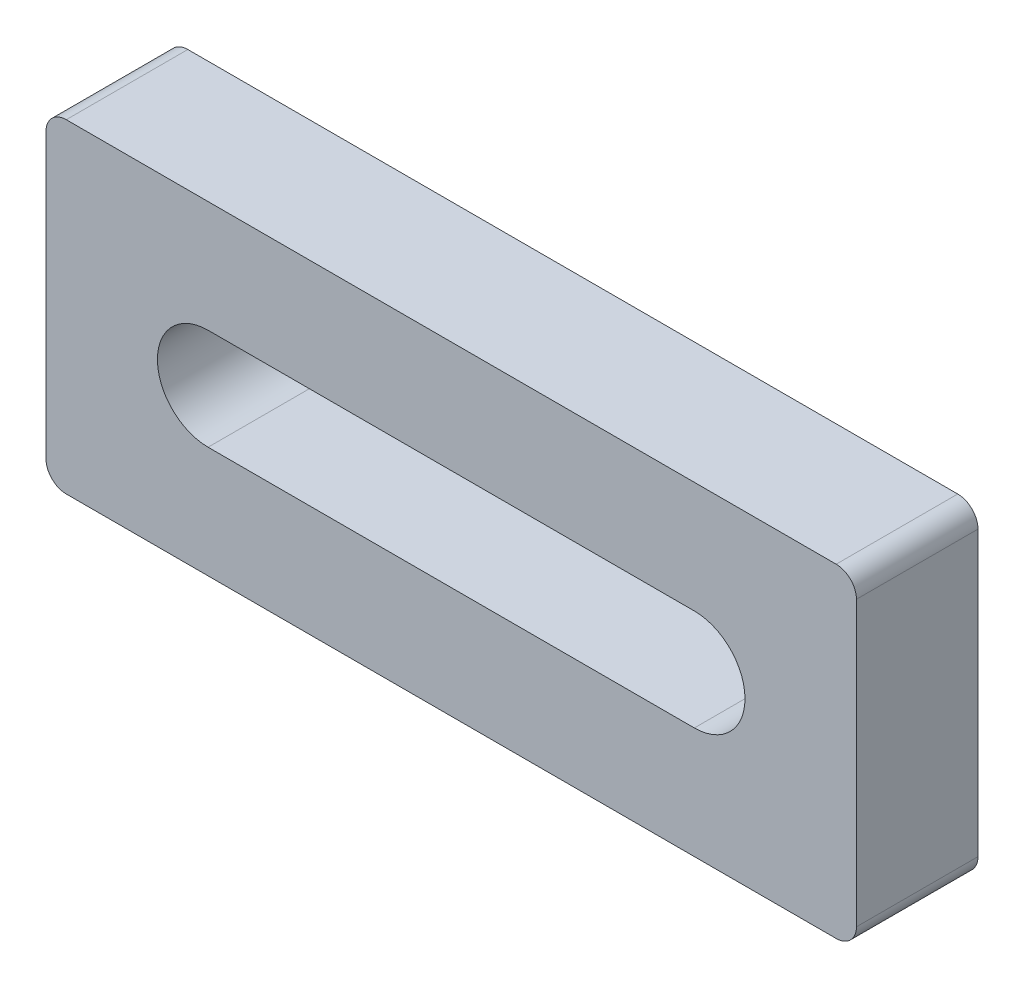
ISO-10303-21;
HEADER;
FILE_DESCRIPTION(('STEP AP214'),'2;1');
FILE_NAME('part.step','',(''),(''),'','','');
FILE_SCHEMA(('AUTOMOTIVE_DESIGN { 1 0 10303 214 1 1 1 1 }'));
ENDSEC;
DATA;
#1=APPLICATION_CONTEXT('core data for automotive mechanical design processes');
#2=APPLICATION_PROTOCOL_DEFINITION('international standard','automotive_design',2000,#1);
#3=PRODUCT_CONTEXT('',#1,'mechanical');
#4=PRODUCT('Part','Part','',(#3));
#5=PRODUCT_RELATED_PRODUCT_CATEGORY('part','',(#4));
#6=PRODUCT_DEFINITION_FORMATION('','',#4);
#7=PRODUCT_DEFINITION_CONTEXT('part definition',#1,'design');
#8=PRODUCT_DEFINITION('design','',#6,#7);
#9=PRODUCT_DEFINITION_SHAPE('','',#8);
#10=(LENGTH_UNIT() NAMED_UNIT(*) SI_UNIT(.MILLI.,.METRE.));
#11=(NAMED_UNIT(*) PLANE_ANGLE_UNIT() SI_UNIT($,.RADIAN.));
#12=(NAMED_UNIT(*) SI_UNIT($,.STERADIAN.) SOLID_ANGLE_UNIT());
#13=UNCERTAINTY_MEASURE_WITH_UNIT(LENGTH_MEASURE(1.E-05),#10,'distance_accuracy_value','');
#14=(GEOMETRIC_REPRESENTATION_CONTEXT(3) GLOBAL_UNCERTAINTY_ASSIGNED_CONTEXT((#13)) GLOBAL_UNIT_ASSIGNED_CONTEXT((#10,
#11,#12)) REPRESENTATION_CONTEXT('',''));
#15=CARTESIAN_POINT('',(0.,0.,0.));
#16=DIRECTION('',(0.,0.,1.));
#17=DIRECTION('',(1.,0.,0.));
#18=AXIS2_PLACEMENT_3D('',#15,#16,#17);
#19=CARTESIAN_POINT('',(-196.85,-3.1749999999999,19.05));
#20=DIRECTION('',(0.,0.,1.));
#21=DIRECTION('',(1.,0.,0.));
#22=AXIS2_PLACEMENT_3D('',#19,#20,#21);
#23=PLANE('',#22);
#24=CARTESIAN_POINT('',(-196.85,-3.1749999999999,19.05));
#25=DIRECTION('',(0.,0.,1.));
#26=DIRECTION('',(1.,0.,0.));
#27=AXIS2_PLACEMENT_3D('',#24,#25,#26);
#28=CIRCLE('',#27,3.17500000000001);
#29=CARTESIAN_POINT('',(-200.025,-3.1749999999999,19.05));
#30=VERTEX_POINT('',#29);
#31=CARTESIAN_POINT('',(-196.85,-6.3499999999999,19.05));
#32=VERTEX_POINT('',#31);
#33=EDGE_CURVE('E175',#30,#32,#28,.T.);
#34=ORIENTED_EDGE('',*,*,#33,.T.);
#35=DIRECTION('',(1.,0.,0.));
#36=VECTOR('',#35,1.);
#37=CARTESIAN_POINT('',(-76.2,-6.34999999999988,19.05));
#38=LINE('',#37,#36);
#39=CARTESIAN_POINT('',(-76.2,-6.34999999999988,19.05));
#40=VERTEX_POINT('',#39);
#41=EDGE_CURVE('E178',#32,#40,#38,.T.);
#42=ORIENTED_EDGE('',*,*,#41,.T.);
#43=CARTESIAN_POINT('',(-76.2,-3.17499999999988,19.05));
#44=DIRECTION('',(0.,0.,1.));
#45=DIRECTION('',(1.,0.,0.));
#46=AXIS2_PLACEMENT_3D('',#43,#44,#45);
#47=CIRCLE('',#46,3.175);
#48=CARTESIAN_POINT('',(-73.025,-3.17499999999988,19.05));
#49=VERTEX_POINT('',#48);
#50=EDGE_CURVE('E180',#40,#49,#47,.T.);
#51=ORIENTED_EDGE('',*,*,#50,.T.);
#52=DIRECTION('',(0.,1.,0.));
#53=VECTOR('',#52,1.);
#54=CARTESIAN_POINT('',(-73.025,-3.17499999999988,19.05));
#55=LINE('',#54,#53);
#56=CARTESIAN_POINT('',(-73.025,41.2750000000001,19.05));
#57=VERTEX_POINT('',#56);
#58=EDGE_CURVE('E182',#49,#57,#55,.T.);
#59=ORIENTED_EDGE('',*,*,#58,.T.);
#60=CARTESIAN_POINT('',(-76.2,41.2750000000001,19.05));
#61=DIRECTION('',(0.,0.,1.));
#62=DIRECTION('',(-1.,0.,0.));
#63=AXIS2_PLACEMENT_3D('',#60,#61,#62);
#64=CIRCLE('',#63,3.17499999999999);
#65=CARTESIAN_POINT('',(-76.2,44.4500000000001,19.05));
#66=VERTEX_POINT('',#65);
#67=EDGE_CURVE('E184',#57,#66,#64,.T.);
#68=ORIENTED_EDGE('',*,*,#67,.T.);
#69=DIRECTION('',(-1.,0.,0.));
#70=VECTOR('',#69,1.);
#71=CARTESIAN_POINT('',(-76.2,44.4500000000001,19.05));
#72=LINE('',#71,#70);
#73=CARTESIAN_POINT('',(-196.85,44.4500000000001,19.05));
#74=VERTEX_POINT('',#73);
#75=EDGE_CURVE('E186',#66,#74,#72,.T.);
#76=ORIENTED_EDGE('',*,*,#75,.T.);
#77=CARTESIAN_POINT('',(-196.85,41.2750000000001,19.05));
#78=DIRECTION('',(0.,0.,1.));
#79=DIRECTION('',(-1.,0.,0.));
#80=AXIS2_PLACEMENT_3D('',#77,#78,#79);
#81=CIRCLE('',#80,3.175);
#82=CARTESIAN_POINT('',(-200.025,41.2750000000001,19.05));
#83=VERTEX_POINT('',#82);
#84=EDGE_CURVE('E188',#74,#83,#81,.T.);
#85=ORIENTED_EDGE('',*,*,#84,.T.);
#86=DIRECTION('',(0.,-1.,0.));
#87=VECTOR('',#86,1.);
#88=CARTESIAN_POINT('',(-200.025,-3.1749999999999,19.05));
#89=LINE('',#88,#87);
#90=EDGE_CURVE('E190',#83,#30,#89,.T.);
#91=ORIENTED_EDGE('',*,*,#90,.T.);
#92=EDGE_LOOP('',(#34,#42,#51,#59,#68,#76,#85,#91));
#93=FACE_BOUND('',#92,.T.);
#94=DIRECTION('',(-1.,0.,0.));
#95=VECTOR('',#94,1.);
#96=CARTESIAN_POINT('',(-174.625,26.9875,19.05));
#97=LINE('',#96,#95);
#98=CARTESIAN_POINT('',(-98.425,26.9875,19.05));
#99=VERTEX_POINT('',#98);
#100=CARTESIAN_POINT('',(-174.625,26.9875,19.05));
#101=VERTEX_POINT('',#100);
#102=EDGE_CURVE('E149',#99,#101,#97,.T.);
#103=ORIENTED_EDGE('',*,*,#102,.F.);
#104=CARTESIAN_POINT('',(-98.425,19.05,19.05));
#105=DIRECTION('',(0.,0.,1.));
#106=DIRECTION('',(1.,0.,0.));
#107=AXIS2_PLACEMENT_3D('',#104,#105,#106);
#108=CIRCLE('',#107,7.93749999999999);
#109=CARTESIAN_POINT('',(-98.425,11.1125,19.05));
#110=VERTEX_POINT('',#109);
#111=EDGE_CURVE('E138',#110,#99,#108,.T.);
#112=ORIENTED_EDGE('',*,*,#111,.F.);
#113=DIRECTION('',(1.,0.,0.));
#114=VECTOR('',#113,1.);
#115=CARTESIAN_POINT('',(-174.625,11.1125,19.05));
#116=LINE('',#115,#114);
#117=CARTESIAN_POINT('',(-174.625,11.1125,19.05));
#118=VERTEX_POINT('',#117);
#119=EDGE_CURVE('E153',#118,#110,#116,.T.);
#120=ORIENTED_EDGE('',*,*,#119,.F.);
#121=CARTESIAN_POINT('',(-174.625,19.05,19.05));
#122=DIRECTION('',(0.,0.,1.));
#123=DIRECTION('',(1.,0.,0.));
#124=AXIS2_PLACEMENT_3D('',#121,#122,#123);
#125=CIRCLE('',#124,7.93749999999999);
#126=EDGE_CURVE('E151',#101,#118,#125,.T.);
#127=ORIENTED_EDGE('',*,*,#126,.F.);
#128=EDGE_LOOP('',(#103,#112,#120,#127));
#129=FACE_BOUND('',#128,.T.);
#130=ADVANCED_FACE('F34',(#93,#129),#23,.T.);
#131=CARTESIAN_POINT('',(-196.85,-3.1749999999999,0.));
#132=DIRECTION('',(0.,0.,1.));
#133=DIRECTION('',(1.,0.,0.));
#134=AXIS2_PLACEMENT_3D('',#131,#132,#133);
#135=PLANE('',#134);
#136=CARTESIAN_POINT('',(-196.85,-3.1749999999999,0.));
#137=DIRECTION('',(0.,0.,1.));
#138=DIRECTION('',(1.,0.,0.));
#139=AXIS2_PLACEMENT_3D('',#136,#137,#138);
#140=CIRCLE('',#139,3.17500000000001);
#141=CARTESIAN_POINT('',(-200.025,-3.1749999999999,0.));
#142=VERTEX_POINT('',#141);
#143=CARTESIAN_POINT('',(-196.85,-6.3499999999999,0.));
#144=VERTEX_POINT('',#143);
#145=EDGE_CURVE('E139',#142,#144,#140,.T.);
#146=ORIENTED_EDGE('',*,*,#145,.F.);
#147=DIRECTION('',(0.,-1.,0.));
#148=VECTOR('',#147,1.);
#149=CARTESIAN_POINT('',(-200.025,-3.1749999999999,0.));
#150=LINE('',#149,#148);
#151=CARTESIAN_POINT('',(-200.025,41.2750000000001,0.));
#152=VERTEX_POINT('',#151);
#153=EDGE_CURVE('E173',#152,#142,#150,.T.);
#154=ORIENTED_EDGE('',*,*,#153,.F.);
#155=CARTESIAN_POINT('',(-196.85,41.2750000000001,0.));
#156=DIRECTION('',(0.,0.,1.));
#157=DIRECTION('',(-1.,0.,0.));
#158=AXIS2_PLACEMENT_3D('',#155,#156,#157);
#159=CIRCLE('',#158,3.175);
#160=CARTESIAN_POINT('',(-196.85,44.4500000000001,0.));
#161=VERTEX_POINT('',#160);
#162=EDGE_CURVE('E171',#161,#152,#159,.T.);
#163=ORIENTED_EDGE('',*,*,#162,.F.);
#164=DIRECTION('',(-1.,0.,0.));
#165=VECTOR('',#164,1.);
#166=CARTESIAN_POINT('',(-76.2,44.4500000000001,0.));
#167=LINE('',#166,#165);
#168=CARTESIAN_POINT('',(-76.2,44.4500000000001,0.));
#169=VERTEX_POINT('',#168);
#170=EDGE_CURVE('E169',#169,#161,#167,.T.);
#171=ORIENTED_EDGE('',*,*,#170,.F.);
#172=CARTESIAN_POINT('',(-76.2,41.2750000000001,0.));
#173=DIRECTION('',(0.,0.,1.));
#174=DIRECTION('',(-1.,0.,0.));
#175=AXIS2_PLACEMENT_3D('',#172,#173,#174);
#176=CIRCLE('',#175,3.17499999999999);
#177=CARTESIAN_POINT('',(-73.025,41.2750000000001,0.));
#178=VERTEX_POINT('',#177);
#179=EDGE_CURVE('E167',#178,#169,#176,.T.);
#180=ORIENTED_EDGE('',*,*,#179,.F.);
#181=DIRECTION('',(0.,1.,0.));
#182=VECTOR('',#181,1.);
#183=CARTESIAN_POINT('',(-73.025,-3.17499999999988,0.));
#184=LINE('',#183,#182);
#185=CARTESIAN_POINT('',(-73.025,-3.17499999999988,0.));
#186=VERTEX_POINT('',#185);
#187=EDGE_CURVE('E165',#186,#178,#184,.T.);
#188=ORIENTED_EDGE('',*,*,#187,.F.);
#189=CARTESIAN_POINT('',(-76.2,-3.17499999999988,0.));
#190=DIRECTION('',(0.,0.,1.));
#191=DIRECTION('',(1.,0.,0.));
#192=AXIS2_PLACEMENT_3D('',#189,#190,#191);
#193=CIRCLE('',#192,3.175);
#194=CARTESIAN_POINT('',(-76.2,-6.34999999999988,0.));
#195=VERTEX_POINT('',#194);
#196=EDGE_CURVE('E163',#195,#186,#193,.T.);
#197=ORIENTED_EDGE('',*,*,#196,.F.);
#198=DIRECTION('',(1.,0.,0.));
#199=VECTOR('',#198,1.);
#200=CARTESIAN_POINT('',(-76.2,-6.34999999999988,0.));
#201=LINE('',#200,#199);
#202=EDGE_CURVE('E161',#144,#195,#201,.T.);
#203=ORIENTED_EDGE('',*,*,#202,.F.);
#204=EDGE_LOOP('',(#146,#154,#163,#171,#180,#188,#197,#203));
#205=FACE_BOUND('',#204,.T.);
#206=CARTESIAN_POINT('',(-98.425,19.05,0.));
#207=DIRECTION('',(0.,0.,1.));
#208=DIRECTION('',(1.,0.,0.));
#209=AXIS2_PLACEMENT_3D('',#206,#207,#208);
#210=CIRCLE('',#209,7.93749999999999);
#211=CARTESIAN_POINT('',(-98.425,11.1125,0.));
#212=VERTEX_POINT('',#211);
#213=CARTESIAN_POINT('',(-98.425,26.9875,0.));
#214=VERTEX_POINT('',#213);
#215=EDGE_CURVE('E57',#212,#214,#210,.T.);
#216=ORIENTED_EDGE('',*,*,#215,.T.);
#217=DIRECTION('',(-1.,0.,0.));
#218=VECTOR('',#217,1.);
#219=CARTESIAN_POINT('',(-174.625,26.9875,0.));
#220=LINE('',#219,#218);
#221=CARTESIAN_POINT('',(-174.625,26.9875,0.));
#222=VERTEX_POINT('',#221);
#223=EDGE_CURVE('E125',#214,#222,#220,.T.);
#224=ORIENTED_EDGE('',*,*,#223,.T.);
#225=CARTESIAN_POINT('',(-174.625,19.05,0.));
#226=DIRECTION('',(0.,0.,1.));
#227=DIRECTION('',(1.,0.,0.));
#228=AXIS2_PLACEMENT_3D('',#225,#226,#227);
#229=CIRCLE('',#228,7.93749999999999);
#230=CARTESIAN_POINT('',(-174.625,11.1125,0.));
#231=VERTEX_POINT('',#230);
#232=EDGE_CURVE('E134',#222,#231,#229,.T.);
#233=ORIENTED_EDGE('',*,*,#232,.T.);
#234=DIRECTION('',(1.,0.,0.));
#235=VECTOR('',#234,1.);
#236=CARTESIAN_POINT('',(-174.625,11.1125,0.));
#237=LINE('',#236,#235);
#238=EDGE_CURVE('E143',#231,#212,#237,.T.);
#239=ORIENTED_EDGE('',*,*,#238,.T.);
#240=EDGE_LOOP('',(#216,#224,#233,#239));
#241=FACE_BOUND('',#240,.T.);
#242=ADVANCED_FACE('F142',(#205,#241),#135,.F.);
#243=CARTESIAN_POINT('',(-196.85,-3.1749999999999,19.05));
#244=DIRECTION('',(0.,0.,-1.));
#245=DIRECTION('',(-1.,0.,0.));
#246=AXIS2_PLACEMENT_3D('',#243,#244,#245);
#247=CYLINDRICAL_SURFACE('',#246,3.17500000000001);
#248=ORIENTED_EDGE('',*,*,#145,.T.);
#249=DIRECTION('',(0.,0.,-1.));
#250=VECTOR('',#249,1.);
#251=CARTESIAN_POINT('',(-196.85,-6.3499999999999,19.05));
#252=LINE('',#251,#250);
#253=EDGE_CURVE('E12',#32,#144,#252,.T.);
#254=ORIENTED_EDGE('',*,*,#253,.F.);
#255=ORIENTED_EDGE('',*,*,#33,.F.);
#256=DIRECTION('',(0.,0.,-1.));
#257=VECTOR('',#256,1.);
#258=CARTESIAN_POINT('',(-200.025,-3.1749999999999,19.05));
#259=LINE('',#258,#257);
#260=EDGE_CURVE('E192',#30,#142,#259,.T.);
#261=ORIENTED_EDGE('',*,*,#260,.T.);
#262=EDGE_LOOP('',(#248,#254,#255,#261));
#263=FACE_BOUND('',#262,.T.);
#264=ADVANCED_FACE('F36',(#263),#247,.T.);
#265=CARTESIAN_POINT('',(-76.2,-6.34999999999988,19.05));
#266=DIRECTION('',(0.,1.,0.));
#267=DIRECTION('',(-1.,0.,0.));
#268=AXIS2_PLACEMENT_3D('',#265,#266,#267);
#269=PLANE('',#268);
#270=ORIENTED_EDGE('',*,*,#202,.T.);
#271=DIRECTION('',(0.,0.,-1.));
#272=VECTOR('',#271,1.);
#273=CARTESIAN_POINT('',(-76.2,-6.34999999999988,19.05));
#274=LINE('',#273,#272);
#275=EDGE_CURVE('E42',#40,#195,#274,.T.);
#276=ORIENTED_EDGE('',*,*,#275,.F.);
#277=ORIENTED_EDGE('',*,*,#41,.F.);
#278=ORIENTED_EDGE('',*,*,#253,.T.);
#279=EDGE_LOOP('',(#270,#276,#277,#278));
#280=FACE_BOUND('',#279,.T.);
#281=ADVANCED_FACE('F236',(#280),#269,.F.);
#282=CARTESIAN_POINT('',(-76.2,-3.17499999999988,19.05));
#283=DIRECTION('',(0.,0.,-1.));
#284=DIRECTION('',(-1.,0.,0.));
#285=AXIS2_PLACEMENT_3D('',#282,#283,#284);
#286=CYLINDRICAL_SURFACE('',#285,3.175);
#287=ORIENTED_EDGE('',*,*,#196,.T.);
#288=DIRECTION('',(0.,0.,-1.));
#289=VECTOR('',#288,1.);
#290=CARTESIAN_POINT('',(-73.025,-3.17499999999988,19.05));
#291=LINE('',#290,#289);
#292=EDGE_CURVE('E207',#49,#186,#291,.T.);
#293=ORIENTED_EDGE('',*,*,#292,.F.);
#294=ORIENTED_EDGE('',*,*,#50,.F.);
#295=ORIENTED_EDGE('',*,*,#275,.T.);
#296=EDGE_LOOP('',(#287,#293,#294,#295));
#297=FACE_BOUND('',#296,.T.);
#298=ADVANCED_FACE('F214',(#297),#286,.T.);
#299=CARTESIAN_POINT('',(-73.025,-3.17499999999988,19.05));
#300=DIRECTION('',(-1.,0.,0.));
#301=DIRECTION('',(0.,0.,1.));
#302=AXIS2_PLACEMENT_3D('',#299,#300,#301);
#303=PLANE('',#302);
#304=ORIENTED_EDGE('',*,*,#187,.T.);
#305=DIRECTION('',(0.,0.,-1.));
#306=VECTOR('',#305,1.);
#307=CARTESIAN_POINT('',(-73.025,41.2750000000001,19.05));
#308=LINE('',#307,#306);
#309=EDGE_CURVE('E204',#57,#178,#308,.T.);
#310=ORIENTED_EDGE('',*,*,#309,.F.);
#311=ORIENTED_EDGE('',*,*,#58,.F.);
#312=ORIENTED_EDGE('',*,*,#292,.T.);
#313=EDGE_LOOP('',(#304,#310,#311,#312));
#314=FACE_BOUND('',#313,.T.);
#315=ADVANCED_FACE('F224',(#314),#303,.F.);
#316=CARTESIAN_POINT('',(-76.2,41.2750000000001,19.05));
#317=DIRECTION('',(0.,0.,-1.));
#318=DIRECTION('',(-1.,0.,0.));
#319=AXIS2_PLACEMENT_3D('',#316,#317,#318);
#320=CYLINDRICAL_SURFACE('',#319,3.17499999999999);
#321=ORIENTED_EDGE('',*,*,#179,.T.);
#322=DIRECTION('',(0.,0.,-1.));
#323=VECTOR('',#322,1.);
#324=CARTESIAN_POINT('',(-76.2,44.4500000000001,19.05));
#325=LINE('',#324,#323);
#326=EDGE_CURVE('E201',#66,#169,#325,.T.);
#327=ORIENTED_EDGE('',*,*,#326,.F.);
#328=ORIENTED_EDGE('',*,*,#67,.F.);
#329=ORIENTED_EDGE('',*,*,#309,.T.);
#330=EDGE_LOOP('',(#321,#327,#328,#329));
#331=FACE_BOUND('',#330,.T.);
#332=ADVANCED_FACE('F228',(#331),#320,.T.);
#333=CARTESIAN_POINT('',(-76.2,44.4500000000001,19.05));
#334=DIRECTION('',(0.,-1.,0.));
#335=DIRECTION('',(1.,0.,0.));
#336=AXIS2_PLACEMENT_3D('',#333,#334,#335);
#337=PLANE('',#336);
#338=ORIENTED_EDGE('',*,*,#170,.T.);
#339=DIRECTION('',(0.,0.,-1.));
#340=VECTOR('',#339,1.);
#341=CARTESIAN_POINT('',(-196.85,44.4500000000001,19.05));
#342=LINE('',#341,#340);
#343=EDGE_CURVE('E198',#74,#161,#342,.T.);
#344=ORIENTED_EDGE('',*,*,#343,.F.);
#345=ORIENTED_EDGE('',*,*,#75,.F.);
#346=ORIENTED_EDGE('',*,*,#326,.T.);
#347=EDGE_LOOP('',(#338,#344,#345,#346));
#348=FACE_BOUND('',#347,.T.);
#349=ADVANCED_FACE('F249',(#348),#337,.F.);
#350=CARTESIAN_POINT('',(-196.85,41.2750000000001,19.05));
#351=DIRECTION('',(0.,0.,-1.));
#352=DIRECTION('',(-1.,0.,0.));
#353=AXIS2_PLACEMENT_3D('',#350,#351,#352);
#354=CYLINDRICAL_SURFACE('',#353,3.175);
#355=ORIENTED_EDGE('',*,*,#162,.T.);
#356=DIRECTION('',(0.,0.,-1.));
#357=VECTOR('',#356,1.);
#358=CARTESIAN_POINT('',(-200.025,41.2750000000001,19.05));
#359=LINE('',#358,#357);
#360=EDGE_CURVE('E195',#83,#152,#359,.T.);
#361=ORIENTED_EDGE('',*,*,#360,.F.);
#362=ORIENTED_EDGE('',*,*,#84,.F.);
#363=ORIENTED_EDGE('',*,*,#343,.T.);
#364=EDGE_LOOP('',(#355,#361,#362,#363));
#365=FACE_BOUND('',#364,.T.);
#366=ADVANCED_FACE('F247',(#365),#354,.T.);
#367=CARTESIAN_POINT('',(-200.025,-3.1749999999999,19.05));
#368=DIRECTION('',(1.,0.,0.));
#369=DIRECTION('',(0.,0.,-1.));
#370=AXIS2_PLACEMENT_3D('',#367,#368,#369);
#371=PLANE('',#370);
#372=ORIENTED_EDGE('',*,*,#153,.T.);
#373=ORIENTED_EDGE('',*,*,#260,.F.);
#374=ORIENTED_EDGE('',*,*,#90,.F.);
#375=ORIENTED_EDGE('',*,*,#360,.T.);
#376=EDGE_LOOP('',(#372,#373,#374,#375));
#377=FACE_BOUND('',#376,.T.);
#378=ADVANCED_FACE('F242',(#377),#371,.F.);
#379=CARTESIAN_POINT('',(-98.425,19.05,19.05));
#380=DIRECTION('',(0.,0.,-1.));
#381=DIRECTION('',(-1.,0.,0.));
#382=AXIS2_PLACEMENT_3D('',#379,#380,#381);
#383=CYLINDRICAL_SURFACE('',#382,7.93749999999999);
#384=ORIENTED_EDGE('',*,*,#215,.F.);
#385=DIRECTION('',(0.,0.,-1.));
#386=VECTOR('',#385,1.);
#387=CARTESIAN_POINT('',(-98.425,11.1125,19.05));
#388=LINE('',#387,#386);
#389=EDGE_CURVE('E155',#110,#212,#388,.T.);
#390=ORIENTED_EDGE('',*,*,#389,.F.);
#391=ORIENTED_EDGE('',*,*,#111,.T.);
#392=DIRECTION('',(0.,0.,-1.));
#393=VECTOR('',#392,1.);
#394=CARTESIAN_POINT('',(-98.425,26.9875,19.05));
#395=LINE('',#394,#393);
#396=EDGE_CURVE('E127',#99,#214,#395,.T.);
#397=ORIENTED_EDGE('',*,*,#396,.T.);
#398=EDGE_LOOP('',(#384,#390,#391,#397));
#399=FACE_BOUND('',#398,.T.);
#400=ADVANCED_FACE('F136',(#399),#383,.F.);
#401=CARTESIAN_POINT('',(-174.625,26.9875,19.05));
#402=DIRECTION('',(0.,-1.,0.));
#403=DIRECTION('',(0.,0.,-1.));
#404=AXIS2_PLACEMENT_3D('',#401,#402,#403);
#405=PLANE('',#404);
#406=ORIENTED_EDGE('',*,*,#223,.F.);
#407=ORIENTED_EDGE('',*,*,#396,.F.);
#408=ORIENTED_EDGE('',*,*,#102,.T.);
#409=DIRECTION('',(0.,0.,-1.));
#410=VECTOR('',#409,1.);
#411=CARTESIAN_POINT('',(-174.625,26.9875,19.05));
#412=LINE('',#411,#410);
#413=EDGE_CURVE('E130',#101,#222,#412,.T.);
#414=ORIENTED_EDGE('',*,*,#413,.T.);
#415=EDGE_LOOP('',(#406,#407,#408,#414));
#416=FACE_BOUND('',#415,.T.);
#417=ADVANCED_FACE('F126',(#416),#405,.T.);
#418=CARTESIAN_POINT('',(-174.625,19.05,19.05));
#419=DIRECTION('',(0.,0.,-1.));
#420=DIRECTION('',(-1.,0.,0.));
#421=AXIS2_PLACEMENT_3D('',#418,#419,#420);
#422=CYLINDRICAL_SURFACE('',#421,7.93749999999999);
#423=ORIENTED_EDGE('',*,*,#232,.F.);
#424=ORIENTED_EDGE('',*,*,#413,.F.);
#425=ORIENTED_EDGE('',*,*,#126,.T.);
#426=DIRECTION('',(0.,0.,-1.));
#427=VECTOR('',#426,1.);
#428=CARTESIAN_POINT('',(-174.625,11.1125,19.05));
#429=LINE('',#428,#427);
#430=EDGE_CURVE('E49',#118,#231,#429,.T.);
#431=ORIENTED_EDGE('',*,*,#430,.T.);
#432=EDGE_LOOP('',(#423,#424,#425,#431));
#433=FACE_BOUND('',#432,.T.);
#434=ADVANCED_FACE('F273',(#433),#422,.F.);
#435=CARTESIAN_POINT('',(-174.625,11.1125,19.05));
#436=DIRECTION('',(0.,1.,0.));
#437=DIRECTION('',(-1.,0.,0.));
#438=AXIS2_PLACEMENT_3D('',#435,#436,#437);
#439=PLANE('',#438);
#440=ORIENTED_EDGE('',*,*,#238,.F.);
#441=ORIENTED_EDGE('',*,*,#430,.F.);
#442=ORIENTED_EDGE('',*,*,#119,.T.);
#443=ORIENTED_EDGE('',*,*,#389,.T.);
#444=EDGE_LOOP('',(#440,#441,#442,#443));
#445=FACE_BOUND('',#444,.T.);
#446=ADVANCED_FACE('F278',(#445),#439,.T.);
#447=CLOSED_SHELL('',(#130,#242,#264,#281,#298,#315,#332,#349,#366,#378,#400,#417,#434,#446));
#448=MANIFOLD_SOLID_BREP('B2',#447);
#449=ADVANCED_BREP_SHAPE_REPRESENTATION('',(#18,#448),#14);
#450=SHAPE_DEFINITION_REPRESENTATION(#9,#449);
ENDSEC;
END-ISO-10303-21;
